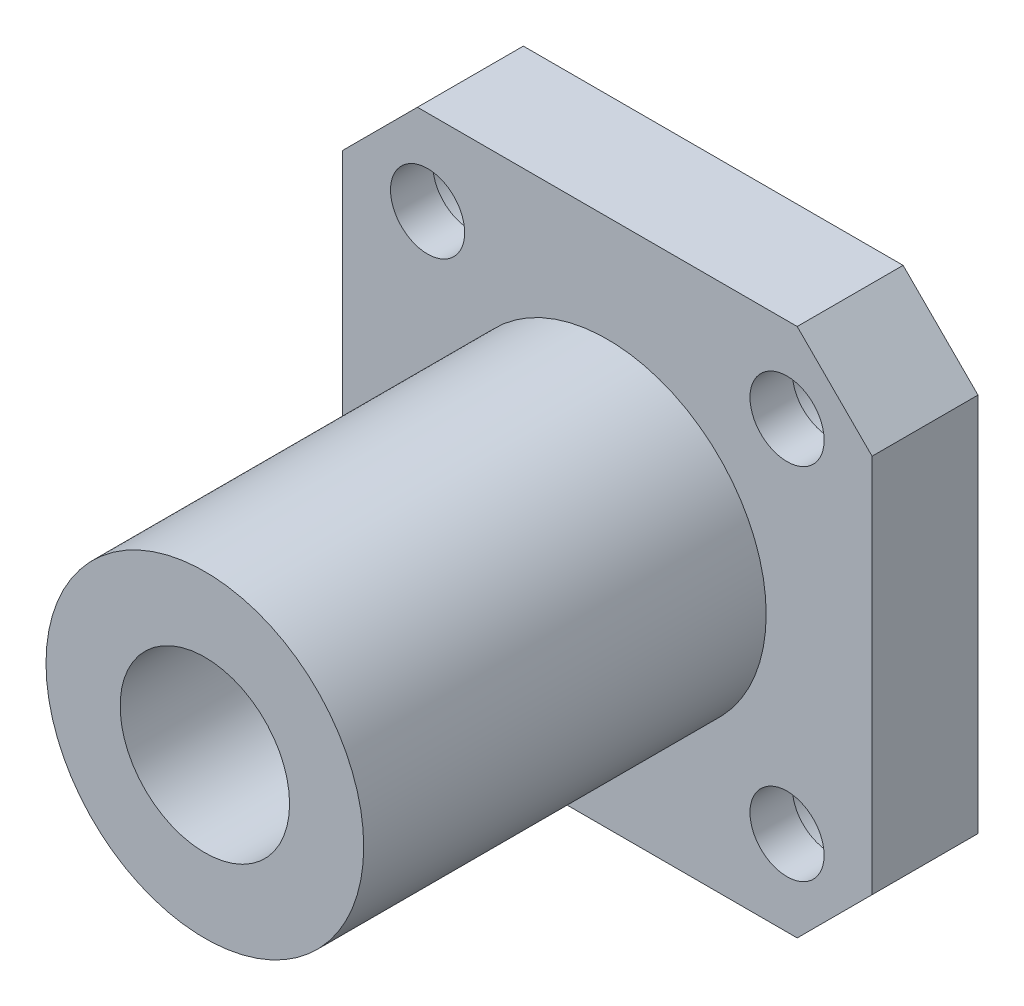
ISO-10303-21;
HEADER;
FILE_DESCRIPTION(('STEP AP214'),'2;1');
FILE_NAME('part.step','',(''),(''),'','','');
FILE_SCHEMA(('AUTOMOTIVE_DESIGN { 1 0 10303 214 1 1 1 1 }'));
ENDSEC;
DATA;
#1=APPLICATION_CONTEXT('core data for automotive mechanical design processes');
#2=APPLICATION_PROTOCOL_DEFINITION('international standard','automotive_design',2000,#1);
#3=PRODUCT_CONTEXT('',#1,'mechanical');
#4=PRODUCT('Part','Part','',(#3));
#5=PRODUCT_RELATED_PRODUCT_CATEGORY('part','',(#4));
#6=PRODUCT_DEFINITION_FORMATION('','',#4);
#7=PRODUCT_DEFINITION_CONTEXT('part definition',#1,'design');
#8=PRODUCT_DEFINITION('design','',#6,#7);
#9=PRODUCT_DEFINITION_SHAPE('','',#8);
#10=(LENGTH_UNIT() NAMED_UNIT(*) SI_UNIT(.MILLI.,.METRE.));
#11=(NAMED_UNIT(*) PLANE_ANGLE_UNIT() SI_UNIT($,.RADIAN.));
#12=(NAMED_UNIT(*) SI_UNIT($,.STERADIAN.) SOLID_ANGLE_UNIT());
#13=UNCERTAINTY_MEASURE_WITH_UNIT(LENGTH_MEASURE(1.E-05),#10,'distance_accuracy_value','');
#14=(GEOMETRIC_REPRESENTATION_CONTEXT(3) GLOBAL_UNCERTAINTY_ASSIGNED_CONTEXT((#13)) GLOBAL_UNIT_ASSIGNED_CONTEXT((#10,
#11,#12)) REPRESENTATION_CONTEXT('',''));
#15=CARTESIAN_POINT('',(0.,0.,0.));
#16=DIRECTION('',(0.,0.,1.));
#17=DIRECTION('',(1.,0.,0.));
#18=AXIS2_PLACEMENT_3D('',#15,#16,#17);
#19=CARTESIAN_POINT('',(-8.48528137423857,8.48528137423857,5.));
#20=DIRECTION('',(0.,0.,-1.));
#21=DIRECTION('',(-1.,0.,0.));
#22=AXIS2_PLACEMENT_3D('',#19,#20,#21);
#23=CYLINDRICAL_SURFACE('',#22,1.75);
#24=CARTESIAN_POINT('',(-8.48528137423857,8.48528137423857,5.));
#25=DIRECTION('',(0.,0.,1.));
#26=DIRECTION('',(1.,0.,0.));
#27=AXIS2_PLACEMENT_3D('',#24,#25,#26);
#28=CIRCLE('',#27,1.75);
#29=CARTESIAN_POINT('',(-6.73528137423857,8.48528137423857,5.));
#30=VERTEX_POINT('',#29);
#31=EDGE_CURVE('E146',#30,#30,#28,.T.);
#32=ORIENTED_EDGE('',*,*,#31,.T.);
#33=EDGE_LOOP('',(#32));
#34=FACE_BOUND('',#33,.T.);
#35=CARTESIAN_POINT('',(-8.48528137423857,8.48528137423857,3.));
#36=DIRECTION('',(0.,0.,-1.));
#37=DIRECTION('',(-1.,0.,0.));
#38=AXIS2_PLACEMENT_3D('',#35,#36,#37);
#39=CIRCLE('',#38,1.75);
#40=CARTESIAN_POINT('',(-10.2352813742386,8.48528137423857,3.));
#41=VERTEX_POINT('',#40);
#42=EDGE_CURVE('E45',#41,#41,#39,.T.);
#43=ORIENTED_EDGE('',*,*,#42,.T.);
#44=EDGE_LOOP('',(#43));
#45=FACE_BOUND('',#44,.T.);
#46=ADVANCED_FACE('F41',(#34,#45),#23,.F.);
#47=CARTESIAN_POINT('',(8.48528137423857,-8.48528137423857,5.));
#48=DIRECTION('',(0.,0.,-1.));
#49=DIRECTION('',(-1.,0.,0.));
#50=AXIS2_PLACEMENT_3D('',#47,#48,#49);
#51=CYLINDRICAL_SURFACE('',#50,1.75);
#52=CARTESIAN_POINT('',(8.48528137423857,-8.48528137423857,5.));
#53=DIRECTION('',(0.,0.,1.));
#54=DIRECTION('',(1.,0.,0.));
#55=AXIS2_PLACEMENT_3D('',#52,#53,#54);
#56=CIRCLE('',#55,1.75);
#57=CARTESIAN_POINT('',(10.2352813742386,-8.48528137423857,5.));
#58=VERTEX_POINT('',#57);
#59=EDGE_CURVE('E205',#58,#58,#56,.T.);
#60=ORIENTED_EDGE('',*,*,#59,.T.);
#61=EDGE_LOOP('',(#60));
#62=FACE_BOUND('',#61,.T.);
#63=CARTESIAN_POINT('',(8.48528137423857,-8.48528137423857,3.));
#64=DIRECTION('',(0.,0.,-1.));
#65=DIRECTION('',(-1.,0.,0.));
#66=AXIS2_PLACEMENT_3D('',#63,#64,#65);
#67=CIRCLE('',#66,1.75);
#68=CARTESIAN_POINT('',(6.73528137423857,-8.48528137423857,3.));
#69=VERTEX_POINT('',#68);
#70=EDGE_CURVE('E177',#69,#69,#67,.T.);
#71=ORIENTED_EDGE('',*,*,#70,.T.);
#72=EDGE_LOOP('',(#71));
#73=FACE_BOUND('',#72,.T.);
#74=ADVANCED_FACE('F248',(#62,#73),#51,.F.);
#75=CARTESIAN_POINT('',(-8.48528137423857,-8.48528137423857,5.));
#76=DIRECTION('',(0.,0.,-1.));
#77=DIRECTION('',(-1.,0.,0.));
#78=AXIS2_PLACEMENT_3D('',#75,#76,#77);
#79=CYLINDRICAL_SURFACE('',#78,1.75);
#80=CARTESIAN_POINT('',(-8.48528137423857,-8.48528137423857,5.));
#81=DIRECTION('',(0.,0.,1.));
#82=DIRECTION('',(1.,0.,0.));
#83=AXIS2_PLACEMENT_3D('',#80,#81,#82);
#84=CIRCLE('',#83,1.75);
#85=CARTESIAN_POINT('',(-6.73528137423857,-8.48528137423857,5.));
#86=VERTEX_POINT('',#85);
#87=EDGE_CURVE('E202',#86,#86,#84,.T.);
#88=ORIENTED_EDGE('',*,*,#87,.T.);
#89=EDGE_LOOP('',(#88));
#90=FACE_BOUND('',#89,.T.);
#91=CARTESIAN_POINT('',(-8.48528137423857,-8.48528137423857,3.));
#92=DIRECTION('',(0.,0.,-1.));
#93=DIRECTION('',(-1.,0.,0.));
#94=AXIS2_PLACEMENT_3D('',#91,#92,#93);
#95=CIRCLE('',#94,1.75);
#96=CARTESIAN_POINT('',(-10.2352813742386,-8.48528137423857,3.));
#97=VERTEX_POINT('',#96);
#98=EDGE_CURVE('E174',#97,#97,#95,.T.);
#99=ORIENTED_EDGE('',*,*,#98,.T.);
#100=EDGE_LOOP('',(#99));
#101=FACE_BOUND('',#100,.T.);
#102=ADVANCED_FACE('F255',(#90,#101),#79,.F.);
#103=CARTESIAN_POINT('',(8.48528137423856,8.48528137423857,5.));
#104=DIRECTION('',(0.,0.,-1.));
#105=DIRECTION('',(-1.,0.,0.));
#106=AXIS2_PLACEMENT_3D('',#103,#104,#105);
#107=CYLINDRICAL_SURFACE('',#106,1.75);
#108=CARTESIAN_POINT('',(8.48528137423856,8.48528137423857,5.));
#109=DIRECTION('',(0.,0.,1.));
#110=DIRECTION('',(1.,0.,0.));
#111=AXIS2_PLACEMENT_3D('',#108,#109,#110);
#112=CIRCLE('',#111,1.75);
#113=CARTESIAN_POINT('',(10.2352813742386,8.48528137423857,5.));
#114=VERTEX_POINT('',#113);
#115=EDGE_CURVE('E199',#114,#114,#112,.T.);
#116=ORIENTED_EDGE('',*,*,#115,.T.);
#117=EDGE_LOOP('',(#116));
#118=FACE_BOUND('',#117,.T.);
#119=CARTESIAN_POINT('',(8.48528137423856,8.48528137423857,3.));
#120=DIRECTION('',(0.,0.,-1.));
#121=DIRECTION('',(-1.,0.,0.));
#122=AXIS2_PLACEMENT_3D('',#119,#120,#121);
#123=CIRCLE('',#122,1.75);
#124=CARTESIAN_POINT('',(6.73528137423857,8.48528137423857,3.));
#125=VERTEX_POINT('',#124);
#126=EDGE_CURVE('E171',#125,#125,#123,.T.);
#127=ORIENTED_EDGE('',*,*,#126,.T.);
#128=EDGE_LOOP('',(#127));
#129=FACE_BOUND('',#128,.T.);
#130=ADVANCED_FACE('F260',(#118,#129),#107,.F.);
#131=CARTESIAN_POINT('',(0.,0.,5.));
#132=DIRECTION('',(0.,0.,-1.));
#133=DIRECTION('',(-1.,0.,0.));
#134=AXIS2_PLACEMENT_3D('',#131,#132,#133);
#135=PLANE('',#134);
#136=ORIENTED_EDGE('',*,*,#115,.F.);
#137=EDGE_LOOP('',(#136));
#138=FACE_BOUND('',#137,.T.);
#139=ORIENTED_EDGE('',*,*,#87,.F.);
#140=EDGE_LOOP('',(#139));
#141=FACE_BOUND('',#140,.T.);
#142=ORIENTED_EDGE('',*,*,#59,.F.);
#143=EDGE_LOOP('',(#142));
#144=FACE_BOUND('',#143,.T.);
#145=ORIENTED_EDGE('',*,*,#31,.F.);
#146=EDGE_LOOP('',(#145));
#147=FACE_BOUND('',#146,.T.);
#148=DIRECTION('',(-0.707106781186547,-0.707106781186548,0.));
#149=VECTOR('',#148,1.);
#150=CARTESIAN_POINT('',(-12.5,8.96446609406726,5.));
#151=LINE('',#150,#149);
#152=CARTESIAN_POINT('',(-8.96446609406727,12.5,5.));
#153=VERTEX_POINT('',#152);
#154=CARTESIAN_POINT('',(-12.5,8.96446609406726,5.));
#155=VERTEX_POINT('',#154);
#156=EDGE_CURVE('E157',#153,#155,#151,.T.);
#157=ORIENTED_EDGE('',*,*,#156,.T.);
#158=DIRECTION('',(0.,-1.,0.));
#159=VECTOR('',#158,1.);
#160=CARTESIAN_POINT('',(-12.5,8.96446609406726,5.));
#161=LINE('',#160,#159);
#162=CARTESIAN_POINT('',(-12.5,-8.96446609406726,5.));
#163=VERTEX_POINT('',#162);
#164=EDGE_CURVE('E104',#155,#163,#161,.T.);
#165=ORIENTED_EDGE('',*,*,#164,.T.);
#166=DIRECTION('',(0.707106781186548,-0.707106781186547,0.));
#167=VECTOR('',#166,1.);
#168=CARTESIAN_POINT('',(-12.5,-8.96446609406726,5.));
#169=LINE('',#168,#167);
#170=CARTESIAN_POINT('',(-8.96446609406726,-12.5,5.));
#171=VERTEX_POINT('',#170);
#172=EDGE_CURVE('E212',#163,#171,#169,.T.);
#173=ORIENTED_EDGE('',*,*,#172,.T.);
#174=DIRECTION('',(1.,0.,0.));
#175=VECTOR('',#174,1.);
#176=CARTESIAN_POINT('',(-8.96446609406726,-12.5,5.));
#177=LINE('',#176,#175);
#178=CARTESIAN_POINT('',(8.96446609406726,-12.5,5.));
#179=VERTEX_POINT('',#178);
#180=EDGE_CURVE('E214',#171,#179,#177,.T.);
#181=ORIENTED_EDGE('',*,*,#180,.T.);
#182=DIRECTION('',(0.707106781186547,0.707106781186548,0.));
#183=VECTOR('',#182,1.);
#184=CARTESIAN_POINT('',(8.96446609406726,-12.5,5.));
#185=LINE('',#184,#183);
#186=CARTESIAN_POINT('',(12.5,-8.96446609406726,5.));
#187=VERTEX_POINT('',#186);
#188=EDGE_CURVE('E124',#179,#187,#185,.T.);
#189=ORIENTED_EDGE('',*,*,#188,.T.);
#190=DIRECTION('',(0.,1.,0.));
#191=VECTOR('',#190,1.);
#192=CARTESIAN_POINT('',(12.5,8.96446609406727,5.));
#193=LINE('',#192,#191);
#194=CARTESIAN_POINT('',(12.5,8.96446609406727,5.));
#195=VERTEX_POINT('',#194);
#196=EDGE_CURVE('E117',#187,#195,#193,.T.);
#197=ORIENTED_EDGE('',*,*,#196,.T.);
#198=DIRECTION('',(-0.707106781186548,0.707106781186547,0.));
#199=VECTOR('',#198,1.);
#200=CARTESIAN_POINT('',(8.96446609406726,12.5,5.));
#201=LINE('',#200,#199);
#202=CARTESIAN_POINT('',(8.96446609406726,12.5,5.));
#203=VERTEX_POINT('',#202);
#204=EDGE_CURVE('E122',#195,#203,#201,.T.);
#205=ORIENTED_EDGE('',*,*,#204,.T.);
#206=DIRECTION('',(-1.,0.,0.));
#207=VECTOR('',#206,1.);
#208=CARTESIAN_POINT('',(-8.96446609406727,12.5,5.));
#209=LINE('',#208,#207);
#210=EDGE_CURVE('E60',#203,#153,#209,.T.);
#211=ORIENTED_EDGE('',*,*,#210,.T.);
#212=EDGE_LOOP('',(#157,#165,#173,#181,#189,#197,#205,#211));
#213=FACE_BOUND('',#212,.T.);
#214=CARTESIAN_POINT('',(0.,0.,5.));
#215=DIRECTION('',(0.,0.,-1.));
#216=DIRECTION('',(-1.,0.,0.));
#217=AXIS2_PLACEMENT_3D('',#214,#215,#216);
#218=CIRCLE('',#217,7.5);
#219=CARTESIAN_POINT('',(-7.5,0.,5.));
#220=VERTEX_POINT('',#219);
#221=EDGE_CURVE('E11',#220,#220,#218,.F.);
#222=ORIENTED_EDGE('',*,*,#221,.F.);
#223=EDGE_LOOP('',(#222));
#224=FACE_BOUND('',#223,.T.);
#225=ADVANCED_FACE('F119',(#138,#141,#144,#147,#213,#224),#135,.F.);
#226=CARTESIAN_POINT('',(0.,0.,0.));
#227=DIRECTION('',(0.,0.,-1.));
#228=DIRECTION('',(-1.,0.,0.));
#229=AXIS2_PLACEMENT_3D('',#226,#227,#228);
#230=PLANE('',#229);
#231=CARTESIAN_POINT('',(8.48528137423857,-8.48528137423857,0.));
#232=DIRECTION('',(0.,0.,-1.));
#233=DIRECTION('',(-1.,0.,0.));
#234=AXIS2_PLACEMENT_3D('',#231,#232,#233);
#235=CIRCLE('',#234,2.8);
#236=CARTESIAN_POINT('',(5.68528137423857,-8.48528137423857,0.));
#237=VERTEX_POINT('',#236);
#238=EDGE_CURVE('E273',#237,#237,#235,.T.);
#239=ORIENTED_EDGE('',*,*,#238,.F.);
#240=EDGE_LOOP('',(#239));
#241=FACE_BOUND('',#240,.T.);
#242=CARTESIAN_POINT('',(-8.48528137423857,-8.48528137423857,0.));
#243=DIRECTION('',(0.,0.,-1.));
#244=DIRECTION('',(-1.,0.,0.));
#245=AXIS2_PLACEMENT_3D('',#242,#243,#244);
#246=CIRCLE('',#245,2.8);
#247=CARTESIAN_POINT('',(-11.2852813742386,-8.48528137423857,0.));
#248=VERTEX_POINT('',#247);
#249=EDGE_CURVE('E277',#248,#248,#246,.T.);
#250=ORIENTED_EDGE('',*,*,#249,.F.);
#251=EDGE_LOOP('',(#250));
#252=FACE_BOUND('',#251,.T.);
#253=CARTESIAN_POINT('',(-8.48528137423857,8.48528137423857,0.));
#254=DIRECTION('',(0.,0.,-1.));
#255=DIRECTION('',(-1.,0.,0.));
#256=AXIS2_PLACEMENT_3D('',#253,#254,#255);
#257=CIRCLE('',#256,2.8);
#258=CARTESIAN_POINT('',(-11.2852813742386,8.48528137423857,0.));
#259=VERTEX_POINT('',#258);
#260=EDGE_CURVE('E281',#259,#259,#257,.T.);
#261=ORIENTED_EDGE('',*,*,#260,.F.);
#262=EDGE_LOOP('',(#261));
#263=FACE_BOUND('',#262,.T.);
#264=CARTESIAN_POINT('',(8.48528137423856,8.48528137423857,0.));
#265=DIRECTION('',(0.,0.,-1.));
#266=DIRECTION('',(-1.,0.,0.));
#267=AXIS2_PLACEMENT_3D('',#264,#265,#266);
#268=CIRCLE('',#267,2.8);
#269=CARTESIAN_POINT('',(5.68528137423856,8.48528137423857,0.));
#270=VERTEX_POINT('',#269);
#271=EDGE_CURVE('E194',#270,#270,#268,.T.);
#272=ORIENTED_EDGE('',*,*,#271,.F.);
#273=EDGE_LOOP('',(#272));
#274=FACE_BOUND('',#273,.T.);
#275=DIRECTION('',(-0.707106781186547,-0.707106781186548,0.));
#276=VECTOR('',#275,1.);
#277=CARTESIAN_POINT('',(-12.5,8.96446609406726,0.));
#278=LINE('',#277,#276);
#279=CARTESIAN_POINT('',(-8.96446609406727,12.5,0.));
#280=VERTEX_POINT('',#279);
#281=CARTESIAN_POINT('',(-12.5,8.96446609406726,0.));
#282=VERTEX_POINT('',#281);
#283=EDGE_CURVE('E142',#280,#282,#278,.T.);
#284=ORIENTED_EDGE('',*,*,#283,.F.);
#285=DIRECTION('',(-1.,0.,0.));
#286=VECTOR('',#285,1.);
#287=CARTESIAN_POINT('',(-8.96446609406727,12.5,0.));
#288=LINE('',#287,#286);
#289=CARTESIAN_POINT('',(8.96446609406726,12.5,0.));
#290=VERTEX_POINT('',#289);
#291=EDGE_CURVE('E95',#290,#280,#288,.T.);
#292=ORIENTED_EDGE('',*,*,#291,.F.);
#293=DIRECTION('',(-0.707106781186548,0.707106781186547,0.));
#294=VECTOR('',#293,1.);
#295=CARTESIAN_POINT('',(8.96446609406726,12.5,0.));
#296=LINE('',#295,#294);
#297=CARTESIAN_POINT('',(12.5,8.96446609406727,0.));
#298=VERTEX_POINT('',#297);
#299=EDGE_CURVE('E89',#298,#290,#296,.T.);
#300=ORIENTED_EDGE('',*,*,#299,.F.);
#301=DIRECTION('',(0.,1.,0.));
#302=VECTOR('',#301,1.);
#303=CARTESIAN_POINT('',(12.5,8.96446609406727,0.));
#304=LINE('',#303,#302);
#305=CARTESIAN_POINT('',(12.5,-8.96446609406726,0.));
#306=VERTEX_POINT('',#305);
#307=EDGE_CURVE('E132',#306,#298,#304,.T.);
#308=ORIENTED_EDGE('',*,*,#307,.F.);
#309=DIRECTION('',(0.707106781186547,0.707106781186548,0.));
#310=VECTOR('',#309,1.);
#311=CARTESIAN_POINT('',(8.96446609406726,-12.5,0.));
#312=LINE('',#311,#310);
#313=CARTESIAN_POINT('',(8.96446609406726,-12.5,0.));
#314=VERTEX_POINT('',#313);
#315=EDGE_CURVE('E152',#314,#306,#312,.T.);
#316=ORIENTED_EDGE('',*,*,#315,.F.);
#317=DIRECTION('',(1.,0.,0.));
#318=VECTOR('',#317,1.);
#319=CARTESIAN_POINT('',(-8.96446609406726,-12.5,0.));
#320=LINE('',#319,#318);
#321=CARTESIAN_POINT('',(-8.96446609406726,-12.5,0.));
#322=VERTEX_POINT('',#321);
#323=EDGE_CURVE('E150',#322,#314,#320,.T.);
#324=ORIENTED_EDGE('',*,*,#323,.F.);
#325=DIRECTION('',(0.707106781186548,-0.707106781186547,0.));
#326=VECTOR('',#325,1.);
#327=CARTESIAN_POINT('',(-12.5,-8.96446609406726,0.));
#328=LINE('',#327,#326);
#329=CARTESIAN_POINT('',(-12.5,-8.96446609406726,0.));
#330=VERTEX_POINT('',#329);
#331=EDGE_CURVE('E148',#330,#322,#328,.T.);
#332=ORIENTED_EDGE('',*,*,#331,.F.);
#333=DIRECTION('',(0.,-1.,0.));
#334=VECTOR('',#333,1.);
#335=CARTESIAN_POINT('',(-12.5,8.96446609406726,0.));
#336=LINE('',#335,#334);
#337=EDGE_CURVE('E145',#282,#330,#336,.T.);
#338=ORIENTED_EDGE('',*,*,#337,.F.);
#339=EDGE_LOOP('',(#284,#292,#300,#308,#316,#324,#332,#338));
#340=FACE_BOUND('',#339,.T.);
#341=CARTESIAN_POINT('',(0.,0.,0.));
#342=DIRECTION('',(0.,0.,1.));
#343=DIRECTION('',(1.,0.,0.));
#344=AXIS2_PLACEMENT_3D('',#341,#342,#343);
#345=CIRCLE('',#344,4.00000000000001);
#346=CARTESIAN_POINT('',(4.00000000000001,0.,0.));
#347=VERTEX_POINT('',#346);
#348=EDGE_CURVE('E191',#347,#347,#345,.T.);
#349=ORIENTED_EDGE('',*,*,#348,.T.);
#350=EDGE_LOOP('',(#349));
#351=FACE_BOUND('',#350,.T.);
#352=ADVANCED_FACE('F227',(#241,#252,#263,#274,#340,#351),#230,.T.);
#353=CARTESIAN_POINT('',(-12.5,8.96446609406726,5.));
#354=DIRECTION('',(0.707106781186548,-0.707106781186547,0.));
#355=DIRECTION('',(0.707106781186547,0.707106781186548,0.));
#356=AXIS2_PLACEMENT_3D('',#353,#354,#355);
#357=PLANE('',#356);
#358=ORIENTED_EDGE('',*,*,#283,.T.);
#359=DIRECTION('',(0.,0.,-1.));
#360=VECTOR('',#359,1.);
#361=CARTESIAN_POINT('',(-12.5,8.96446609406726,5.));
#362=LINE('',#361,#360);
#363=EDGE_CURVE('E51',#155,#282,#362,.T.);
#364=ORIENTED_EDGE('',*,*,#363,.F.);
#365=ORIENTED_EDGE('',*,*,#156,.F.);
#366=DIRECTION('',(0.,0.,-1.));
#367=VECTOR('',#366,1.);
#368=CARTESIAN_POINT('',(-8.96446609406727,12.5,5.));
#369=LINE('',#368,#367);
#370=EDGE_CURVE('E138',#153,#280,#369,.T.);
#371=ORIENTED_EDGE('',*,*,#370,.T.);
#372=EDGE_LOOP('',(#358,#364,#365,#371));
#373=FACE_BOUND('',#372,.T.);
#374=ADVANCED_FACE('F43',(#373),#357,.F.);
#375=CARTESIAN_POINT('',(-12.5,8.96446609406726,5.));
#376=DIRECTION('',(1.,0.,0.));
#377=DIRECTION('',(0.,1.,0.));
#378=AXIS2_PLACEMENT_3D('',#375,#376,#377);
#379=PLANE('',#378);
#380=ORIENTED_EDGE('',*,*,#337,.T.);
#381=DIRECTION('',(0.,0.,-1.));
#382=VECTOR('',#381,1.);
#383=CARTESIAN_POINT('',(-12.5,-8.96446609406726,5.));
#384=LINE('',#383,#382);
#385=EDGE_CURVE('E167',#163,#330,#384,.T.);
#386=ORIENTED_EDGE('',*,*,#385,.F.);
#387=ORIENTED_EDGE('',*,*,#164,.F.);
#388=ORIENTED_EDGE('',*,*,#363,.T.);
#389=EDGE_LOOP('',(#380,#386,#387,#388));
#390=FACE_BOUND('',#389,.T.);
#391=ADVANCED_FACE('F269',(#390),#379,.F.);
#392=CARTESIAN_POINT('',(-12.5,-8.96446609406726,5.));
#393=DIRECTION('',(0.707106781186547,0.707106781186548,0.));
#394=DIRECTION('',(-0.707106781186548,0.707106781186547,0.));
#395=AXIS2_PLACEMENT_3D('',#392,#393,#394);
#396=PLANE('',#395);
#397=ORIENTED_EDGE('',*,*,#331,.T.);
#398=DIRECTION('',(0.,0.,-1.));
#399=VECTOR('',#398,1.);
#400=CARTESIAN_POINT('',(-8.96446609406726,-12.5,5.));
#401=LINE('',#400,#399);
#402=EDGE_CURVE('E164',#171,#322,#401,.T.);
#403=ORIENTED_EDGE('',*,*,#402,.F.);
#404=ORIENTED_EDGE('',*,*,#172,.F.);
#405=ORIENTED_EDGE('',*,*,#385,.T.);
#406=EDGE_LOOP('',(#397,#403,#404,#405));
#407=FACE_BOUND('',#406,.T.);
#408=ADVANCED_FACE('F468',(#407),#396,.F.);
#409=CARTESIAN_POINT('',(-8.96446609406726,-12.5,5.));
#410=DIRECTION('',(0.,1.,0.));
#411=DIRECTION('',(0.,0.,1.));
#412=AXIS2_PLACEMENT_3D('',#409,#410,#411);
#413=PLANE('',#412);
#414=ORIENTED_EDGE('',*,*,#323,.T.);
#415=DIRECTION('',(0.,0.,-1.));
#416=VECTOR('',#415,1.);
#417=CARTESIAN_POINT('',(8.96446609406726,-12.5,5.));
#418=LINE('',#417,#416);
#419=EDGE_CURVE('E161',#179,#314,#418,.T.);
#420=ORIENTED_EDGE('',*,*,#419,.F.);
#421=ORIENTED_EDGE('',*,*,#180,.F.);
#422=ORIENTED_EDGE('',*,*,#402,.T.);
#423=EDGE_LOOP('',(#414,#420,#421,#422));
#424=FACE_BOUND('',#423,.T.);
#425=ADVANCED_FACE('F220',(#424),#413,.F.);
#426=CARTESIAN_POINT('',(8.96446609406726,-12.5,5.));
#427=DIRECTION('',(-0.707106781186548,0.707106781186547,0.));
#428=DIRECTION('',(-0.707106781186547,-0.707106781186548,0.));
#429=AXIS2_PLACEMENT_3D('',#426,#427,#428);
#430=PLANE('',#429);
#431=ORIENTED_EDGE('',*,*,#315,.T.);
#432=DIRECTION('',(0.,0.,-1.));
#433=VECTOR('',#432,1.);
#434=CARTESIAN_POINT('',(12.5,-8.96446609406726,5.));
#435=LINE('',#434,#433);
#436=EDGE_CURVE('E133',#187,#306,#435,.T.);
#437=ORIENTED_EDGE('',*,*,#436,.F.);
#438=ORIENTED_EDGE('',*,*,#188,.F.);
#439=ORIENTED_EDGE('',*,*,#419,.T.);
#440=EDGE_LOOP('',(#431,#437,#438,#439));
#441=FACE_BOUND('',#440,.T.);
#442=ADVANCED_FACE('F224',(#441),#430,.F.);
#443=CARTESIAN_POINT('',(12.5,8.96446609406727,5.));
#444=DIRECTION('',(-1.,0.,0.));
#445=DIRECTION('',(0.,-1.,0.));
#446=AXIS2_PLACEMENT_3D('',#443,#444,#445);
#447=PLANE('',#446);
#448=ORIENTED_EDGE('',*,*,#307,.T.);
#449=DIRECTION('',(0.,0.,-1.));
#450=VECTOR('',#449,1.);
#451=CARTESIAN_POINT('',(12.5,8.96446609406727,5.));
#452=LINE('',#451,#450);
#453=EDGE_CURVE('E129',#195,#298,#452,.T.);
#454=ORIENTED_EDGE('',*,*,#453,.F.);
#455=ORIENTED_EDGE('',*,*,#196,.F.);
#456=ORIENTED_EDGE('',*,*,#436,.T.);
#457=EDGE_LOOP('',(#448,#454,#455,#456));
#458=FACE_BOUND('',#457,.T.);
#459=ADVANCED_FACE('F130',(#458),#447,.F.);
#460=CARTESIAN_POINT('',(8.96446609406726,12.5,5.));
#461=DIRECTION('',(-0.707106781186547,-0.707106781186548,0.));
#462=DIRECTION('',(0.707106781186548,-0.707106781186547,0.));
#463=AXIS2_PLACEMENT_3D('',#460,#461,#462);
#464=PLANE('',#463);
#465=ORIENTED_EDGE('',*,*,#299,.T.);
#466=DIRECTION('',(0.,0.,-1.));
#467=VECTOR('',#466,1.);
#468=CARTESIAN_POINT('',(8.96446609406726,12.5,5.));
#469=LINE('',#468,#467);
#470=EDGE_CURVE('E134',#203,#290,#469,.T.);
#471=ORIENTED_EDGE('',*,*,#470,.F.);
#472=ORIENTED_EDGE('',*,*,#204,.F.);
#473=ORIENTED_EDGE('',*,*,#453,.T.);
#474=EDGE_LOOP('',(#465,#471,#472,#473));
#475=FACE_BOUND('',#474,.T.);
#476=ADVANCED_FACE('F136',(#475),#464,.F.);
#477=CARTESIAN_POINT('',(-8.96446609406727,12.5,5.));
#478=DIRECTION('',(0.,-1.,0.));
#479=DIRECTION('',(0.,0.,-1.));
#480=AXIS2_PLACEMENT_3D('',#477,#478,#479);
#481=PLANE('',#480);
#482=ORIENTED_EDGE('',*,*,#291,.T.);
#483=ORIENTED_EDGE('',*,*,#370,.F.);
#484=ORIENTED_EDGE('',*,*,#210,.F.);
#485=ORIENTED_EDGE('',*,*,#470,.T.);
#486=EDGE_LOOP('',(#482,#483,#484,#485));
#487=FACE_BOUND('',#486,.T.);
#488=ADVANCED_FACE('F233',(#487),#481,.F.);
#489=CARTESIAN_POINT('',(0.,0.,5.));
#490=DIRECTION('',(0.,0.,-1.));
#491=DIRECTION('',(-1.,0.,0.));
#492=AXIS2_PLACEMENT_3D('',#489,#490,#491);
#493=CYLINDRICAL_SURFACE('',#492,4.00000000000001);
#494=ORIENTED_EDGE('',*,*,#348,.F.);
#495=EDGE_LOOP('',(#494));
#496=FACE_BOUND('',#495,.T.);
#497=CARTESIAN_POINT('',(0.,0.,24.));
#498=DIRECTION('',(0.,0.,1.));
#499=DIRECTION('',(1.,0.,0.));
#500=AXIS2_PLACEMENT_3D('',#497,#498,#499);
#501=CIRCLE('',#500,4.00000000000001);
#502=CARTESIAN_POINT('',(4.00000000000001,0.,24.));
#503=VERTEX_POINT('',#502);
#504=EDGE_CURVE('E182',#503,#503,#501,.T.);
#505=ORIENTED_EDGE('',*,*,#504,.T.);
#506=EDGE_LOOP('',(#505));
#507=FACE_BOUND('',#506,.T.);
#508=ADVANCED_FACE('F235',(#496,#507),#493,.F.);
#509=CARTESIAN_POINT('',(0.,0.,24.));
#510=DIRECTION('',(0.,0.,1.));
#511=DIRECTION('',(1.,0.,0.));
#512=AXIS2_PLACEMENT_3D('',#509,#510,#511);
#513=PLANE('',#512);
#514=CARTESIAN_POINT('',(0.,0.,24.));
#515=DIRECTION('',(0.,0.,1.));
#516=DIRECTION('',(1.,0.,0.));
#517=AXIS2_PLACEMENT_3D('',#514,#515,#516);
#518=CIRCLE('',#517,7.5);
#519=CARTESIAN_POINT('',(7.5,0.,24.));
#520=VERTEX_POINT('',#519);
#521=EDGE_CURVE('E186',#520,#520,#518,.T.);
#522=ORIENTED_EDGE('',*,*,#521,.T.);
#523=EDGE_LOOP('',(#522));
#524=FACE_BOUND('',#523,.T.);
#525=ORIENTED_EDGE('',*,*,#504,.F.);
#526=EDGE_LOOP('',(#525));
#527=FACE_BOUND('',#526,.T.);
#528=ADVANCED_FACE('F242',(#524,#527),#513,.T.);
#529=CARTESIAN_POINT('',(0.,0.,24.));
#530=DIRECTION('',(0.,0.,-1.));
#531=DIRECTION('',(-1.,0.,0.));
#532=AXIS2_PLACEMENT_3D('',#529,#530,#531);
#533=CYLINDRICAL_SURFACE('',#532,7.5);
#534=ORIENTED_EDGE('',*,*,#521,.F.);
#535=EDGE_LOOP('',(#534));
#536=FACE_BOUND('',#535,.T.);
#537=ORIENTED_EDGE('',*,*,#221,.T.);
#538=EDGE_LOOP('',(#537));
#539=FACE_BOUND('',#538,.T.);
#540=ADVANCED_FACE('F326',(#536,#539),#533,.T.);
#541=CARTESIAN_POINT('',(8.48528137423856,8.48528137423857,3.));
#542=DIRECTION('',(0.,0.,-1.));
#543=DIRECTION('',(-1.,0.,0.));
#544=AXIS2_PLACEMENT_3D('',#541,#542,#543);
#545=CYLINDRICAL_SURFACE('',#544,2.8);
#546=CARTESIAN_POINT('',(8.48528137423856,8.48528137423857,3.));
#547=DIRECTION('',(0.,0.,-1.));
#548=DIRECTION('',(-1.,0.,0.));
#549=AXIS2_PLACEMENT_3D('',#546,#547,#548);
#550=CIRCLE('',#549,2.8);
#551=CARTESIAN_POINT('',(5.68528137423856,8.48528137423857,3.));
#552=VERTEX_POINT('',#551);
#553=EDGE_CURVE('E175',#552,#552,#550,.T.);
#554=ORIENTED_EDGE('',*,*,#553,.F.);
#555=EDGE_LOOP('',(#554));
#556=FACE_BOUND('',#555,.T.);
#557=ORIENTED_EDGE('',*,*,#271,.T.);
#558=EDGE_LOOP('',(#557));
#559=FACE_BOUND('',#558,.T.);
#560=ADVANCED_FACE('F323',(#556,#559),#545,.F.);
#561=CARTESIAN_POINT('',(8.48528137423856,8.48528137423857,3.));
#562=DIRECTION('',(0.,0.,-1.));
#563=DIRECTION('',(-1.,0.,0.));
#564=AXIS2_PLACEMENT_3D('',#561,#562,#563);
#565=PLANE('',#564);
#566=ORIENTED_EDGE('',*,*,#126,.F.);
#567=EDGE_LOOP('',(#566));
#568=FACE_BOUND('',#567,.T.);
#569=ORIENTED_EDGE('',*,*,#553,.T.);
#570=EDGE_LOOP('',(#569));
#571=FACE_BOUND('',#570,.T.);
#572=ADVANCED_FACE('F320',(#568,#571),#565,.T.);
#573=CARTESIAN_POINT('',(-8.48528137423857,-8.48528137423857,3.));
#574=DIRECTION('',(0.,0.,-1.));
#575=DIRECTION('',(-1.,0.,0.));
#576=AXIS2_PLACEMENT_3D('',#573,#574,#575);
#577=CYLINDRICAL_SURFACE('',#576,2.8);
#578=CARTESIAN_POINT('',(-8.48528137423857,-8.48528137423857,3.));
#579=DIRECTION('',(0.,0.,-1.));
#580=DIRECTION('',(-1.,0.,0.));
#581=AXIS2_PLACEMENT_3D('',#578,#579,#580);
#582=CIRCLE('',#581,2.8);
#583=CARTESIAN_POINT('',(-11.2852813742386,-8.48528137423857,3.));
#584=VERTEX_POINT('',#583);
#585=EDGE_CURVE('E293',#584,#584,#582,.T.);
#586=ORIENTED_EDGE('',*,*,#585,.F.);
#587=EDGE_LOOP('',(#586));
#588=FACE_BOUND('',#587,.T.);
#589=ORIENTED_EDGE('',*,*,#249,.T.);
#590=EDGE_LOOP('',(#589));
#591=FACE_BOUND('',#590,.T.);
#592=ADVANCED_FACE('F315',(#588,#591),#577,.F.);
#593=CARTESIAN_POINT('',(-8.48528137423857,-8.48528137423857,3.));
#594=DIRECTION('',(0.,0.,-1.));
#595=DIRECTION('',(-1.,0.,0.));
#596=AXIS2_PLACEMENT_3D('',#593,#594,#595);
#597=PLANE('',#596);
#598=ORIENTED_EDGE('',*,*,#98,.F.);
#599=EDGE_LOOP('',(#598));
#600=FACE_BOUND('',#599,.T.);
#601=ORIENTED_EDGE('',*,*,#585,.T.);
#602=EDGE_LOOP('',(#601));
#603=FACE_BOUND('',#602,.T.);
#604=ADVANCED_FACE('F306',(#600,#603),#597,.T.);
#605=CARTESIAN_POINT('',(8.48528137423857,-8.48528137423857,3.));
#606=DIRECTION('',(0.,0.,-1.));
#607=DIRECTION('',(-1.,0.,0.));
#608=AXIS2_PLACEMENT_3D('',#605,#606,#607);
#609=CYLINDRICAL_SURFACE('',#608,2.8);
#610=CARTESIAN_POINT('',(8.48528137423857,-8.48528137423857,3.));
#611=DIRECTION('',(0.,0.,-1.));
#612=DIRECTION('',(-1.,0.,0.));
#613=AXIS2_PLACEMENT_3D('',#610,#611,#612);
#614=CIRCLE('',#613,2.8);
#615=CARTESIAN_POINT('',(5.68528137423857,-8.48528137423857,3.));
#616=VERTEX_POINT('',#615);
#617=EDGE_CURVE('E297',#616,#616,#614,.T.);
#618=ORIENTED_EDGE('',*,*,#617,.F.);
#619=EDGE_LOOP('',(#618));
#620=FACE_BOUND('',#619,.T.);
#621=ORIENTED_EDGE('',*,*,#238,.T.);
#622=EDGE_LOOP('',(#621));
#623=FACE_BOUND('',#622,.T.);
#624=ADVANCED_FACE('F303',(#620,#623),#609,.F.);
#625=CARTESIAN_POINT('',(8.48528137423857,-8.48528137423857,3.));
#626=DIRECTION('',(0.,0.,-1.));
#627=DIRECTION('',(-1.,0.,0.));
#628=AXIS2_PLACEMENT_3D('',#625,#626,#627);
#629=PLANE('',#628);
#630=ORIENTED_EDGE('',*,*,#70,.F.);
#631=EDGE_LOOP('',(#630));
#632=FACE_BOUND('',#631,.T.);
#633=ORIENTED_EDGE('',*,*,#617,.T.);
#634=EDGE_LOOP('',(#633));
#635=FACE_BOUND('',#634,.T.);
#636=ADVANCED_FACE('F301',(#632,#635),#629,.T.);
#637=CARTESIAN_POINT('',(-8.48528137423857,8.48528137423857,3.));
#638=DIRECTION('',(0.,0.,-1.));
#639=DIRECTION('',(-1.,0.,0.));
#640=AXIS2_PLACEMENT_3D('',#637,#638,#639);
#641=CYLINDRICAL_SURFACE('',#640,2.8);
#642=CARTESIAN_POINT('',(-8.48528137423857,8.48528137423857,3.));
#643=DIRECTION('',(0.,0.,-1.));
#644=DIRECTION('',(-1.,0.,0.));
#645=AXIS2_PLACEMENT_3D('',#642,#643,#644);
#646=CIRCLE('',#645,2.8);
#647=CARTESIAN_POINT('',(-11.2852813742386,8.48528137423857,3.));
#648=VERTEX_POINT('',#647);
#649=EDGE_CURVE('E286',#648,#648,#646,.T.);
#650=ORIENTED_EDGE('',*,*,#649,.F.);
#651=EDGE_LOOP('',(#650));
#652=FACE_BOUND('',#651,.T.);
#653=ORIENTED_EDGE('',*,*,#260,.T.);
#654=EDGE_LOOP('',(#653));
#655=FACE_BOUND('',#654,.T.);
#656=ADVANCED_FACE('F312',(#652,#655),#641,.F.);
#657=CARTESIAN_POINT('',(-8.48528137423857,8.48528137423857,3.));
#658=DIRECTION('',(0.,0.,-1.));
#659=DIRECTION('',(-1.,0.,0.));
#660=AXIS2_PLACEMENT_3D('',#657,#658,#659);
#661=PLANE('',#660);
#662=ORIENTED_EDGE('',*,*,#42,.F.);
#663=EDGE_LOOP('',(#662));
#664=FACE_BOUND('',#663,.T.);
#665=ORIENTED_EDGE('',*,*,#649,.T.);
#666=EDGE_LOOP('',(#665));
#667=FACE_BOUND('',#666,.T.);
#668=ADVANCED_FACE('F349',(#664,#667),#661,.T.);
#669=CLOSED_SHELL('',(#46,#74,#102,#130,#225,#352,#374,#391,#408,#425,#442,#459,#476,#488,#508,
#528,#540,#560,#572,#592,#604,#624,#636,#656,#668));
#670=MANIFOLD_SOLID_BREP('B2',#669);
#671=ADVANCED_BREP_SHAPE_REPRESENTATION('',(#18,#670),#14);
#672=SHAPE_DEFINITION_REPRESENTATION(#9,#671);
ENDSEC;
END-ISO-10303-21;
